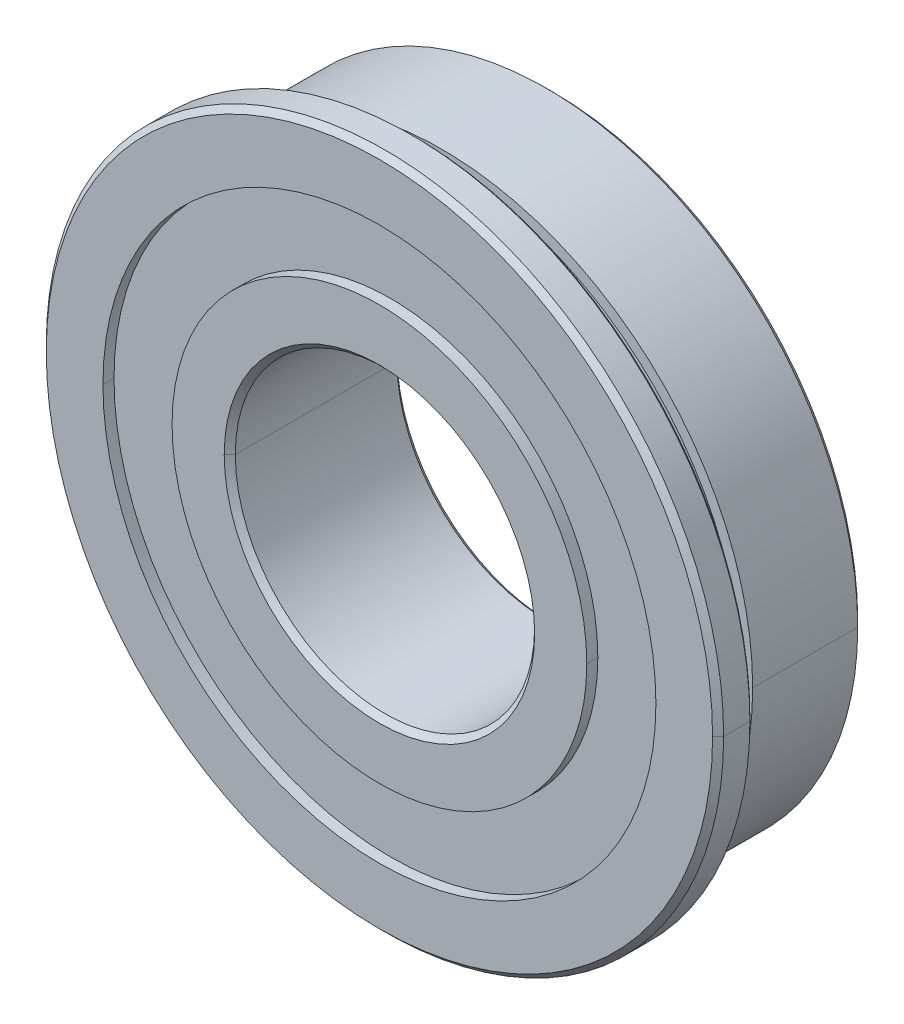
ISO-10303-21;
HEADER;
FILE_DESCRIPTION(('STEP AP214'),'2;1');
FILE_NAME('part.step','',(''),(''),'','','');
FILE_SCHEMA(('AUTOMOTIVE_DESIGN { 1 0 10303 214 1 1 1 1 }'));
ENDSEC;
DATA;
#1=APPLICATION_CONTEXT('core data for automotive mechanical design processes');
#2=APPLICATION_PROTOCOL_DEFINITION('international standard','automotive_design',2000,#1);
#3=PRODUCT_CONTEXT('',#1,'mechanical');
#4=PRODUCT('Part','Part','',(#3));
#5=PRODUCT_RELATED_PRODUCT_CATEGORY('part','',(#4));
#6=PRODUCT_DEFINITION_FORMATION('','',#4);
#7=PRODUCT_DEFINITION_CONTEXT('part definition',#1,'design');
#8=PRODUCT_DEFINITION('design','',#6,#7);
#9=PRODUCT_DEFINITION_SHAPE('','',#8);
#10=(LENGTH_UNIT() NAMED_UNIT(*) SI_UNIT(.MILLI.,.METRE.));
#11=(NAMED_UNIT(*) PLANE_ANGLE_UNIT() SI_UNIT($,.RADIAN.));
#12=(NAMED_UNIT(*) SI_UNIT($,.STERADIAN.) SOLID_ANGLE_UNIT());
#13=UNCERTAINTY_MEASURE_WITH_UNIT(LENGTH_MEASURE(1.E-05),#10,'distance_accuracy_value','');
#14=(GEOMETRIC_REPRESENTATION_CONTEXT(3) GLOBAL_UNCERTAINTY_ASSIGNED_CONTEXT((#13)) GLOBAL_UNIT_ASSIGNED_CONTEXT((#10,
#11,#12)) REPRESENTATION_CONTEXT('',''));
#15=CARTESIAN_POINT('',(0.,0.,0.));
#16=DIRECTION('',(0.,0.,1.));
#17=DIRECTION('',(1.,0.,0.));
#18=AXIS2_PLACEMENT_3D('',#15,#16,#17);
#19=CARTESIAN_POINT('',(0.,0.,2.50825));
#20=DIRECTION('',(0.,0.,1.));
#21=DIRECTION('',(1.,0.,0.));
#22=AXIS2_PLACEMENT_3D('',#19,#20,#21);
#23=CONICAL_SURFACE('',#22,15.5575,0.785398163397442);
#24=DIRECTION('',(-0.707106781186543,0.,0.707106781186552));
#25=VECTOR('',#24,1.);
#26=CARTESIAN_POINT('',(-15.5575,0.,2.50825));
#27=LINE('',#26,#25);
#28=CARTESIAN_POINT('',(-15.4305,0.,2.38125));
#29=VERTEX_POINT('',#28);
#30=CARTESIAN_POINT('',(-15.5575,0.,2.50825));
#31=VERTEX_POINT('',#30);
#32=EDGE_CURVE('E226',#29,#31,#27,.T.);
#33=ORIENTED_EDGE('',*,*,#32,.F.);
#34=CARTESIAN_POINT('',(0.,0.,2.38125));
#35=DIRECTION('',(0.,0.,-1.));
#36=DIRECTION('',(1.,0.,0.));
#37=AXIS2_PLACEMENT_3D('',#34,#35,#36);
#38=CIRCLE('',#37,15.4305);
#39=CARTESIAN_POINT('',(15.4305,0.,2.38125));
#40=VERTEX_POINT('',#39);
#41=EDGE_CURVE('E326',#40,#29,#38,.T.);
#42=ORIENTED_EDGE('',*,*,#41,.F.);
#43=DIRECTION('',(0.707106781186543,0.,0.707106781186552));
#44=VECTOR('',#43,1.);
#45=CARTESIAN_POINT('',(15.5575,0.,2.50825));
#46=LINE('',#45,#44);
#47=CARTESIAN_POINT('',(15.5575,0.,2.50825));
#48=VERTEX_POINT('',#47);
#49=EDGE_CURVE('E225',#40,#48,#46,.T.);
#50=ORIENTED_EDGE('',*,*,#49,.T.);
#51=CARTESIAN_POINT('',(0.,0.,2.50825));
#52=DIRECTION('',(0.,0.,1.));
#53=DIRECTION('',(1.,0.,0.));
#54=AXIS2_PLACEMENT_3D('',#51,#52,#53);
#55=CIRCLE('',#54,15.5575);
#56=EDGE_CURVE('E203',#31,#48,#55,.T.);
#57=ORIENTED_EDGE('',*,*,#56,.F.);
#58=EDGE_LOOP('',(#33,#42,#50,#57));
#59=FACE_BOUND('',#58,.T.);
#60=ADVANCED_FACE('F15',(#59),#23,.T.);
#61=CARTESIAN_POINT('',(0.,0.,3.71475));
#62=DIRECTION('',(0.,0.,1.));
#63=DIRECTION('',(1.,0.,0.));
#64=AXIS2_PLACEMENT_3D('',#61,#62,#63);
#65=CONICAL_SURFACE('',#64,6.875,0.785398163397442);
#66=DIRECTION('',(-0.707106781186543,0.,0.707106781186552));
#67=VECTOR('',#66,1.);
#68=CARTESIAN_POINT('',(-6.875,0.,3.71475));
#69=LINE('',#68,#67);
#70=CARTESIAN_POINT('',(-6.875,0.,3.71475));
#71=VERTEX_POINT('',#70);
#72=CARTESIAN_POINT('',(-7.129,0.,3.96875));
#73=VERTEX_POINT('',#72);
#74=EDGE_CURVE('E263',#71,#73,#69,.T.);
#75=ORIENTED_EDGE('',*,*,#74,.F.);
#76=CARTESIAN_POINT('',(0.,0.,3.71475));
#77=DIRECTION('',(0.,0.,1.));
#78=DIRECTION('',(-1.,0.,0.));
#79=AXIS2_PLACEMENT_3D('',#76,#77,#78);
#80=CIRCLE('',#79,6.875);
#81=CARTESIAN_POINT('',(6.875,0.,3.71475));
#82=VERTEX_POINT('',#81);
#83=EDGE_CURVE('E233',#82,#71,#80,.T.);
#84=ORIENTED_EDGE('',*,*,#83,.F.);
#85=DIRECTION('',(0.707106781186543,0.,0.707106781186552));
#86=VECTOR('',#85,1.);
#87=CARTESIAN_POINT('',(6.875,0.,3.71475));
#88=LINE('',#87,#86);
#89=CARTESIAN_POINT('',(7.129,0.,3.96875));
#90=VERTEX_POINT('',#89);
#91=EDGE_CURVE('E315',#82,#90,#88,.T.);
#92=ORIENTED_EDGE('',*,*,#91,.T.);
#93=CARTESIAN_POINT('',(0.,0.,3.96875));
#94=DIRECTION('',(0.,0.,-1.));
#95=DIRECTION('',(-1.,0.,0.));
#96=AXIS2_PLACEMENT_3D('',#93,#94,#95);
#97=CIRCLE('',#96,7.129);
#98=EDGE_CURVE('E304',#73,#90,#97,.T.);
#99=ORIENTED_EDGE('',*,*,#98,.F.);
#100=EDGE_LOOP('',(#75,#84,#92,#99));
#101=FACE_BOUND('',#100,.T.);
#102=ADVANCED_FACE('F521',(#101),#65,.F.);
#103=CARTESIAN_POINT('',(0.,0.,-3.96875));
#104=DIRECTION('',(0.,0.,-1.));
#105=DIRECTION('',(-1.,0.,0.));
#106=AXIS2_PLACEMENT_3D('',#103,#104,#105);
#107=CONICAL_SURFACE('',#106,7.129,0.785398163397446);
#108=DIRECTION('',(0.707106781186546,0.,-0.707106781186549));
#109=VECTOR('',#108,1.);
#110=CARTESIAN_POINT('',(7.129,0.,-3.96875));
#111=LINE('',#110,#109);
#112=CARTESIAN_POINT('',(6.875,0.,-3.71475));
#113=VERTEX_POINT('',#112);
#114=CARTESIAN_POINT('',(7.129,0.,-3.96875));
#115=VERTEX_POINT('',#114);
#116=EDGE_CURVE('E307',#113,#115,#111,.T.);
#117=ORIENTED_EDGE('',*,*,#116,.F.);
#118=CARTESIAN_POINT('',(0.,0.,-3.71475));
#119=DIRECTION('',(0.,0.,-1.));
#120=DIRECTION('',(1.,0.,0.));
#121=AXIS2_PLACEMENT_3D('',#118,#119,#120);
#122=CIRCLE('',#121,6.875);
#123=CARTESIAN_POINT('',(-6.875,0.,-3.71475));
#124=VERTEX_POINT('',#123);
#125=EDGE_CURVE('E208',#124,#113,#122,.T.);
#126=ORIENTED_EDGE('',*,*,#125,.F.);
#127=DIRECTION('',(-0.707106781186546,0.,-0.707106781186549));
#128=VECTOR('',#127,1.);
#129=CARTESIAN_POINT('',(-7.129,0.,-3.96875));
#130=LINE('',#129,#128);
#131=CARTESIAN_POINT('',(-7.129,0.,-3.96875));
#132=VERTEX_POINT('',#131);
#133=EDGE_CURVE('E244',#124,#132,#130,.T.);
#134=ORIENTED_EDGE('',*,*,#133,.T.);
#135=CARTESIAN_POINT('',(0.,0.,-3.96875));
#136=DIRECTION('',(0.,0.,1.));
#137=DIRECTION('',(1.,0.,0.));
#138=AXIS2_PLACEMENT_3D('',#135,#136,#137);
#139=CIRCLE('',#138,7.129);
#140=EDGE_CURVE('E200',#115,#132,#139,.T.);
#141=ORIENTED_EDGE('',*,*,#140,.F.);
#142=EDGE_LOOP('',(#117,#126,#134,#141));
#143=FACE_BOUND('',#142,.T.);
#144=ADVANCED_FACE('F526',(#143),#107,.F.);
#145=CARTESIAN_POINT('',(0.,0.,-3.71475));
#146=DIRECTION('',(0.,0.,1.));
#147=DIRECTION('',(1.,0.,0.));
#148=AXIS2_PLACEMENT_3D('',#145,#146,#147);
#149=CONICAL_SURFACE('',#148,14.2875,0.785398163397445);
#150=DIRECTION('',(-0.707106781186545,0.,0.70710678118655));
#151=VECTOR('',#150,1.);
#152=CARTESIAN_POINT('',(-14.2875,0.,-3.71475));
#153=LINE('',#152,#151);
#154=CARTESIAN_POINT('',(-14.0335,0.,-3.96875));
#155=VERTEX_POINT('',#154);
#156=CARTESIAN_POINT('',(-14.2875,0.,-3.71475));
#157=VERTEX_POINT('',#156);
#158=EDGE_CURVE('E193',#155,#157,#153,.T.);
#159=ORIENTED_EDGE('',*,*,#158,.F.);
#160=CARTESIAN_POINT('',(0.,0.,-3.96875));
#161=DIRECTION('',(0.,0.,-1.));
#162=DIRECTION('',(1.,0.,0.));
#163=AXIS2_PLACEMENT_3D('',#160,#161,#162);
#164=CIRCLE('',#163,14.0335);
#165=CARTESIAN_POINT('',(14.0335,0.,-3.96875));
#166=VERTEX_POINT('',#165);
#167=EDGE_CURVE('E237',#166,#155,#164,.T.);
#168=ORIENTED_EDGE('',*,*,#167,.F.);
#169=DIRECTION('',(0.707106781186545,0.,0.70710678118655));
#170=VECTOR('',#169,1.);
#171=CARTESIAN_POINT('',(14.2875,0.,-3.71475));
#172=LINE('',#171,#170);
#173=CARTESIAN_POINT('',(14.2875,0.,-3.71475));
#174=VERTEX_POINT('',#173);
#175=EDGE_CURVE('E195',#166,#174,#172,.T.);
#176=ORIENTED_EDGE('',*,*,#175,.T.);
#177=CARTESIAN_POINT('',(0.,0.,-3.71475));
#178=DIRECTION('',(0.,0.,1.));
#179=DIRECTION('',(1.,0.,0.));
#180=AXIS2_PLACEMENT_3D('',#177,#178,#179);
#181=CIRCLE('',#180,14.2875);
#182=EDGE_CURVE('E273',#157,#174,#181,.T.);
#183=ORIENTED_EDGE('',*,*,#182,.F.);
#184=EDGE_LOOP('',(#159,#168,#176,#183));
#185=FACE_BOUND('',#184,.T.);
#186=ADVANCED_FACE('F891',(#185),#149,.T.);
#187=CARTESIAN_POINT('',(0.,0.,3.96875));
#188=DIRECTION('',(0.,0.,-1.));
#189=DIRECTION('',(-1.,0.,0.));
#190=AXIS2_PLACEMENT_3D('',#187,#188,#189);
#191=CONICAL_SURFACE('',#190,15.3035,0.785398163397455);
#192=DIRECTION('',(0.707106781186552,0.,-0.707106781186543));
#193=VECTOR('',#192,1.);
#194=CARTESIAN_POINT('',(15.3035,0.,3.96875));
#195=LINE('',#194,#193);
#196=CARTESIAN_POINT('',(15.3035,0.,3.96875));
#197=VERTEX_POINT('',#196);
#198=CARTESIAN_POINT('',(15.5575,0.,3.71475));
#199=VERTEX_POINT('',#198);
#200=EDGE_CURVE('E232',#197,#199,#195,.T.);
#201=ORIENTED_EDGE('',*,*,#200,.F.);
#202=CARTESIAN_POINT('',(0.,0.,3.96875));
#203=DIRECTION('',(0.,0.,1.));
#204=DIRECTION('',(-1.,0.,0.));
#205=AXIS2_PLACEMENT_3D('',#202,#203,#204);
#206=CIRCLE('',#205,15.3035);
#207=CARTESIAN_POINT('',(-15.3035,0.,3.96875));
#208=VERTEX_POINT('',#207);
#209=EDGE_CURVE('E209',#208,#197,#206,.T.);
#210=ORIENTED_EDGE('',*,*,#209,.F.);
#211=DIRECTION('',(-0.707106781186552,0.,-0.707106781186543));
#212=VECTOR('',#211,1.);
#213=CARTESIAN_POINT('',(-15.3035,0.,3.96875));
#214=LINE('',#213,#212);
#215=CARTESIAN_POINT('',(-15.5575,0.,3.71475));
#216=VERTEX_POINT('',#215);
#217=EDGE_CURVE('E231',#208,#216,#214,.T.);
#218=ORIENTED_EDGE('',*,*,#217,.T.);
#219=CARTESIAN_POINT('',(0.,0.,3.71475));
#220=DIRECTION('',(0.,0.,-1.));
#221=DIRECTION('',(-1.,0.,0.));
#222=AXIS2_PLACEMENT_3D('',#219,#220,#221);
#223=CIRCLE('',#222,15.5575);
#224=EDGE_CURVE('E316',#199,#216,#223,.T.);
#225=ORIENTED_EDGE('',*,*,#224,.F.);
#226=EDGE_LOOP('',(#201,#210,#218,#225));
#227=FACE_BOUND('',#226,.T.);
#228=ADVANCED_FACE('F486',(#227),#191,.T.);
#229=CARTESIAN_POINT('',(0.,0.,3.46075));
#230=DIRECTION('',(0.,0.,1.));
#231=DIRECTION('',(1.,0.,0.));
#232=AXIS2_PLACEMENT_3D('',#229,#230,#231);
#233=CYLINDRICAL_SURFACE('',#232,9.525);
#234=DIRECTION('',(0.,0.,1.));
#235=VECTOR('',#234,1.);
#236=CARTESIAN_POINT('',(-9.525,0.,3.46075));
#237=LINE('',#236,#235);
#238=CARTESIAN_POINT('',(-9.525,0.,3.46075));
#239=VERTEX_POINT('',#238);
#240=CARTESIAN_POINT('',(-9.525,0.,3.96875));
#241=VERTEX_POINT('',#240);
#242=EDGE_CURVE('E278',#239,#241,#237,.T.);
#243=ORIENTED_EDGE('',*,*,#242,.F.);
#244=CARTESIAN_POINT('',(0.,0.,3.46075));
#245=DIRECTION('',(0.,0.,-1.));
#246=DIRECTION('',(-1.,0.,0.));
#247=AXIS2_PLACEMENT_3D('',#244,#245,#246);
#248=CIRCLE('',#247,9.525);
#249=CARTESIAN_POINT('',(9.525,0.,3.46075));
#250=VERTEX_POINT('',#249);
#251=EDGE_CURVE('E10',#250,#239,#248,.T.);
#252=ORIENTED_EDGE('',*,*,#251,.F.);
#253=DIRECTION('',(0.,0.,1.));
#254=VECTOR('',#253,1.);
#255=CARTESIAN_POINT('',(9.525,0.,3.46075));
#256=LINE('',#255,#254);
#257=CARTESIAN_POINT('',(9.525,0.,3.96875));
#258=VERTEX_POINT('',#257);
#259=EDGE_CURVE('E215',#250,#258,#256,.T.);
#260=ORIENTED_EDGE('',*,*,#259,.T.);
#261=CARTESIAN_POINT('',(0.,0.,3.96875));
#262=DIRECTION('',(0.,0.,-1.));
#263=DIRECTION('',(-1.,0.,0.));
#264=AXIS2_PLACEMENT_3D('',#261,#262,#263);
#265=CIRCLE('',#264,9.525);
#266=EDGE_CURVE('E19',#258,#241,#265,.T.);
#267=ORIENTED_EDGE('',*,*,#266,.T.);
#268=EDGE_LOOP('',(#243,#252,#260,#267));
#269=FACE_BOUND('',#268,.T.);
#270=ADVANCED_FACE('F421',(#269),#233,.T.);
#271=CARTESIAN_POINT('',(0.,0.,3.46075));
#272=DIRECTION('',(0.,0.,1.));
#273=DIRECTION('',(1.,0.,0.));
#274=AXIS2_PLACEMENT_3D('',#271,#272,#273);
#275=CYLINDRICAL_SURFACE('',#274,12.7);
#276=DIRECTION('',(0.,0.,1.));
#277=VECTOR('',#276,1.);
#278=CARTESIAN_POINT('',(-12.7,0.,3.46075));
#279=LINE('',#278,#277);
#280=CARTESIAN_POINT('',(-12.7,0.,3.46075));
#281=VERTEX_POINT('',#280);
#282=CARTESIAN_POINT('',(-12.7,0.,3.96875));
#283=VERTEX_POINT('',#282);
#284=EDGE_CURVE('E262',#281,#283,#279,.T.);
#285=ORIENTED_EDGE('',*,*,#284,.F.);
#286=CARTESIAN_POINT('',(0.,0.,3.46075));
#287=DIRECTION('',(0.,0.,-1.));
#288=DIRECTION('',(-1.,0.,0.));
#289=AXIS2_PLACEMENT_3D('',#286,#287,#288);
#290=CIRCLE('',#289,12.7);
#291=CARTESIAN_POINT('',(12.7,0.,3.46075));
#292=VERTEX_POINT('',#291);
#293=EDGE_CURVE('E26',#281,#292,#290,.T.);
#294=ORIENTED_EDGE('',*,*,#293,.T.);
#295=DIRECTION('',(0.,0.,1.));
#296=VECTOR('',#295,1.);
#297=CARTESIAN_POINT('',(12.7,0.,3.46075));
#298=LINE('',#297,#296);
#299=CARTESIAN_POINT('',(12.7,0.,3.96875));
#300=VERTEX_POINT('',#299);
#301=EDGE_CURVE('E179',#292,#300,#298,.T.);
#302=ORIENTED_EDGE('',*,*,#301,.T.);
#303=CARTESIAN_POINT('',(0.,0.,3.96875));
#304=DIRECTION('',(0.,0.,-1.));
#305=DIRECTION('',(-1.,0.,0.));
#306=AXIS2_PLACEMENT_3D('',#303,#304,#305);
#307=CIRCLE('',#306,12.7);
#308=EDGE_CURVE('E205',#283,#300,#307,.T.);
#309=ORIENTED_EDGE('',*,*,#308,.F.);
#310=EDGE_LOOP('',(#285,#294,#302,#309));
#311=FACE_BOUND('',#310,.T.);
#312=ADVANCED_FACE('F471',(#311),#275,.F.);
#313=CARTESIAN_POINT('',(0.,0.,3.46075));
#314=DIRECTION('',(0.,0.,1.));
#315=DIRECTION('',(1.,0.,0.));
#316=AXIS2_PLACEMENT_3D('',#313,#314,#315);
#317=PLANE('',#316);
#318=ORIENTED_EDGE('',*,*,#251,.T.);
#319=CARTESIAN_POINT('',(0.,0.,3.46075));
#320=DIRECTION('',(0.,0.,-1.));
#321=DIRECTION('',(-1.,0.,0.));
#322=AXIS2_PLACEMENT_3D('',#319,#320,#321);
#323=CIRCLE('',#322,9.525);
#324=EDGE_CURVE('E274',#239,#250,#323,.T.);
#325=ORIENTED_EDGE('',*,*,#324,.T.);
#326=EDGE_LOOP('',(#318,#325));
#327=FACE_BOUND('',#326,.T.);
#328=CARTESIAN_POINT('',(0.,0.,3.46075));
#329=DIRECTION('',(0.,0.,-1.));
#330=DIRECTION('',(-1.,0.,0.));
#331=AXIS2_PLACEMENT_3D('',#328,#329,#330);
#332=CIRCLE('',#331,12.7);
#333=EDGE_CURVE('E218',#292,#281,#332,.T.);
#334=ORIENTED_EDGE('',*,*,#333,.F.);
#335=ORIENTED_EDGE('',*,*,#293,.F.);
#336=EDGE_LOOP('',(#334,#335));
#337=FACE_BOUND('',#336,.T.);
#338=ADVANCED_FACE('F423',(#327,#337),#317,.T.);
#339=CARTESIAN_POINT('',(0.,0.,-3.46075));
#340=DIRECTION('',(0.,0.,-1.));
#341=DIRECTION('',(-1.,0.,0.));
#342=AXIS2_PLACEMENT_3D('',#339,#340,#341);
#343=CYLINDRICAL_SURFACE('',#342,9.525);
#344=DIRECTION('',(0.,0.,-1.));
#345=VECTOR('',#344,1.);
#346=CARTESIAN_POINT('',(9.525,0.,-3.46075));
#347=LINE('',#346,#345);
#348=CARTESIAN_POINT('',(9.525,0.,-3.46075));
#349=VERTEX_POINT('',#348);
#350=CARTESIAN_POINT('',(9.525,0.,-3.96875));
#351=VERTEX_POINT('',#350);
#352=EDGE_CURVE('E163',#349,#351,#347,.T.);
#353=ORIENTED_EDGE('',*,*,#352,.F.);
#354=CARTESIAN_POINT('',(0.,0.,-3.46075));
#355=DIRECTION('',(0.,0.,-1.));
#356=DIRECTION('',(-1.,0.,0.));
#357=AXIS2_PLACEMENT_3D('',#354,#355,#356);
#358=CIRCLE('',#357,9.525);
#359=CARTESIAN_POINT('',(-9.525,0.,-3.46075));
#360=VERTEX_POINT('',#359);
#361=EDGE_CURVE('E151',#349,#360,#358,.T.);
#362=ORIENTED_EDGE('',*,*,#361,.T.);
#363=DIRECTION('',(0.,0.,-1.));
#364=VECTOR('',#363,1.);
#365=CARTESIAN_POINT('',(-9.525,0.,-3.46075));
#366=LINE('',#365,#364);
#367=CARTESIAN_POINT('',(-9.525,0.,-3.96875));
#368=VERTEX_POINT('',#367);
#369=EDGE_CURVE('E160',#360,#368,#366,.T.);
#370=ORIENTED_EDGE('',*,*,#369,.T.);
#371=CARTESIAN_POINT('',(0.,0.,-3.96875));
#372=DIRECTION('',(0.,0.,-1.));
#373=DIRECTION('',(-1.,0.,0.));
#374=AXIS2_PLACEMENT_3D('',#371,#372,#373);
#375=CIRCLE('',#374,9.525);
#376=EDGE_CURVE('E204',#351,#368,#375,.T.);
#377=ORIENTED_EDGE('',*,*,#376,.F.);
#378=EDGE_LOOP('',(#353,#362,#370,#377));
#379=FACE_BOUND('',#378,.T.);
#380=ADVANCED_FACE('F159',(#379),#343,.T.);
#381=CARTESIAN_POINT('',(0.,0.,-3.46075));
#382=DIRECTION('',(0.,0.,-1.));
#383=DIRECTION('',(0.,-1.,0.));
#384=AXIS2_PLACEMENT_3D('',#381,#382,#383);
#385=PLANE('',#384);
#386=CARTESIAN_POINT('',(0.,0.,-3.46075));
#387=DIRECTION('',(0.,0.,-1.));
#388=DIRECTION('',(-1.,0.,0.));
#389=AXIS2_PLACEMENT_3D('',#386,#387,#388);
#390=CIRCLE('',#389,9.525);
#391=EDGE_CURVE('E170',#360,#349,#390,.T.);
#392=ORIENTED_EDGE('',*,*,#391,.F.);
#393=ORIENTED_EDGE('',*,*,#361,.F.);
#394=EDGE_LOOP('',(#392,#393));
#395=FACE_BOUND('',#394,.T.);
#396=CARTESIAN_POINT('',(0.,0.,-3.46075));
#397=DIRECTION('',(0.,0.,-1.));
#398=DIRECTION('',(-1.,0.,0.));
#399=AXIS2_PLACEMENT_3D('',#396,#397,#398);
#400=CIRCLE('',#399,12.7);
#401=CARTESIAN_POINT('',(-12.7,0.,-3.46075));
#402=VERTEX_POINT('',#401);
#403=CARTESIAN_POINT('',(12.7,0.,-3.46075));
#404=VERTEX_POINT('',#403);
#405=EDGE_CURVE('E166',#402,#404,#400,.T.);
#406=ORIENTED_EDGE('',*,*,#405,.T.);
#407=CARTESIAN_POINT('',(0.,0.,-3.46075));
#408=DIRECTION('',(0.,0.,-1.));
#409=DIRECTION('',(-1.,0.,0.));
#410=AXIS2_PLACEMENT_3D('',#407,#408,#409);
#411=CIRCLE('',#410,12.7);
#412=EDGE_CURVE('E174',#404,#402,#411,.T.);
#413=ORIENTED_EDGE('',*,*,#412,.T.);
#414=EDGE_LOOP('',(#406,#413));
#415=FACE_BOUND('',#414,.T.);
#416=ADVANCED_FACE('F176',(#395,#415),#385,.T.);
#417=CARTESIAN_POINT('',(0.,0.,-3.46075));
#418=DIRECTION('',(0.,0.,-1.));
#419=DIRECTION('',(-1.,0.,0.));
#420=AXIS2_PLACEMENT_3D('',#417,#418,#419);
#421=CYLINDRICAL_SURFACE('',#420,12.7);
#422=DIRECTION('',(0.,0.,-1.));
#423=VECTOR('',#422,1.);
#424=CARTESIAN_POINT('',(12.7,0.,-3.46075));
#425=LINE('',#424,#423);
#426=CARTESIAN_POINT('',(12.7,0.,-3.96875));
#427=VERTEX_POINT('',#426);
#428=EDGE_CURVE('E292',#404,#427,#425,.T.);
#429=ORIENTED_EDGE('',*,*,#428,.F.);
#430=ORIENTED_EDGE('',*,*,#405,.F.);
#431=DIRECTION('',(0.,0.,-1.));
#432=VECTOR('',#431,1.);
#433=CARTESIAN_POINT('',(-12.7,0.,-3.46075));
#434=LINE('',#433,#432);
#435=CARTESIAN_POINT('',(-12.7,0.,-3.96875));
#436=VERTEX_POINT('',#435);
#437=EDGE_CURVE('E366',#402,#436,#434,.T.);
#438=ORIENTED_EDGE('',*,*,#437,.T.);
#439=CARTESIAN_POINT('',(0.,0.,-3.96875));
#440=DIRECTION('',(0.,0.,-1.));
#441=DIRECTION('',(-1.,0.,0.));
#442=AXIS2_PLACEMENT_3D('',#439,#440,#441);
#443=CIRCLE('',#442,12.7);
#444=EDGE_CURVE('E269',#436,#427,#443,.T.);
#445=ORIENTED_EDGE('',*,*,#444,.T.);
#446=EDGE_LOOP('',(#429,#430,#438,#445));
#447=FACE_BOUND('',#446,.T.);
#448=ADVANCED_FACE('F505',(#447),#421,.F.);
#449=CARTESIAN_POINT('',(0.,14.2875,2.38125));
#450=DIRECTION('',(0.,0.,1.));
#451=DIRECTION('',(1.,0.,0.));
#452=AXIS2_PLACEMENT_3D('',#449,#450,#451);
#453=PLANE('',#452);
#454=CARTESIAN_POINT('',(0.,0.,2.38125));
#455=DIRECTION('',(0.,0.,1.));
#456=DIRECTION('',(1.,0.,0.));
#457=AXIS2_PLACEMENT_3D('',#454,#455,#456);
#458=CIRCLE('',#457,13.7795);
#459=CARTESIAN_POINT('',(13.7795,0.,2.38125));
#460=VERTEX_POINT('',#459);
#461=CARTESIAN_POINT('',(-13.7795,0.,2.38125));
#462=VERTEX_POINT('',#461);
#463=EDGE_CURVE('E299',#460,#462,#458,.T.);
#464=ORIENTED_EDGE('',*,*,#463,.T.);
#465=CARTESIAN_POINT('',(0.,0.,2.38125));
#466=DIRECTION('',(0.,0.,1.));
#467=DIRECTION('',(1.,0.,0.));
#468=AXIS2_PLACEMENT_3D('',#465,#466,#467);
#469=CIRCLE('',#468,13.7795);
#470=EDGE_CURVE('E258',#462,#460,#469,.T.);
#471=ORIENTED_EDGE('',*,*,#470,.T.);
#472=EDGE_LOOP('',(#464,#471));
#473=FACE_BOUND('',#472,.T.);
#474=ORIENTED_EDGE('',*,*,#41,.T.);
#475=CARTESIAN_POINT('',(0.,0.,2.38125));
#476=DIRECTION('',(0.,0.,-1.));
#477=DIRECTION('',(1.,0.,0.));
#478=AXIS2_PLACEMENT_3D('',#475,#476,#477);
#479=CIRCLE('',#478,15.4305);
#480=EDGE_CURVE('E341',#29,#40,#479,.T.);
#481=ORIENTED_EDGE('',*,*,#480,.T.);
#482=EDGE_LOOP('',(#474,#481));
#483=FACE_BOUND('',#482,.T.);
#484=ADVANCED_FACE('F502',(#473,#483),#453,.F.);
#485=CARTESIAN_POINT('',(0.,0.,6.18055555555556));
#486=DIRECTION('',(0.,0.,1.));
#487=DIRECTION('',(1.,0.,0.));
#488=AXIS2_PLACEMENT_3D('',#485,#486,#487);
#489=CYLINDRICAL_SURFACE('',#488,13.7795);
#490=DIRECTION('',(0.,0.,1.));
#491=VECTOR('',#490,1.);
#492=CARTESIAN_POINT('',(-13.7795,0.,6.18055555555556));
#493=LINE('',#492,#491);
#494=CARTESIAN_POINT('',(-13.7795,0.,1.11125));
#495=VERTEX_POINT('',#494);
#496=EDGE_CURVE('E296',#495,#462,#493,.T.);
#497=ORIENTED_EDGE('',*,*,#496,.F.);
#498=CARTESIAN_POINT('',(0.,0.,1.11125));
#499=DIRECTION('',(0.,0.,1.));
#500=DIRECTION('',(1.,0.,0.));
#501=AXIS2_PLACEMENT_3D('',#498,#499,#500);
#502=CIRCLE('',#501,13.7795);
#503=CARTESIAN_POINT('',(13.7795,0.,1.11125));
#504=VERTEX_POINT('',#503);
#505=EDGE_CURVE('E255',#495,#504,#502,.T.);
#506=ORIENTED_EDGE('',*,*,#505,.T.);
#507=DIRECTION('',(0.,0.,1.));
#508=VECTOR('',#507,1.);
#509=CARTESIAN_POINT('',(13.7795,0.,6.18055555555556));
#510=LINE('',#509,#508);
#511=EDGE_CURVE('E348',#504,#460,#510,.T.);
#512=ORIENTED_EDGE('',*,*,#511,.T.);
#513=ORIENTED_EDGE('',*,*,#470,.F.);
#514=EDGE_LOOP('',(#497,#506,#512,#513));
#515=FACE_BOUND('',#514,.T.);
#516=ADVANCED_FACE('F504',(#515),#489,.T.);
#517=CARTESIAN_POINT('',(0.,13.7795,1.11125));
#518=DIRECTION('',(0.,0.,-1.));
#519=DIRECTION('',(0.,-1.,0.));
#520=AXIS2_PLACEMENT_3D('',#517,#518,#519);
#521=PLANE('',#520);
#522=CARTESIAN_POINT('',(0.,0.,1.11125));
#523=DIRECTION('',(0.,0.,1.));
#524=DIRECTION('',(1.,0.,0.));
#525=AXIS2_PLACEMENT_3D('',#522,#523,#524);
#526=CIRCLE('',#525,13.7795);
#527=EDGE_CURVE('E300',#504,#495,#526,.T.);
#528=ORIENTED_EDGE('',*,*,#527,.F.);
#529=ORIENTED_EDGE('',*,*,#505,.F.);
#530=EDGE_LOOP('',(#528,#529));
#531=FACE_BOUND('',#530,.T.);
#532=CARTESIAN_POINT('',(0.,0.,1.11125));
#533=DIRECTION('',(0.,0.,1.));
#534=DIRECTION('',(1.,0.,0.));
#535=AXIS2_PLACEMENT_3D('',#532,#533,#534);
#536=CIRCLE('',#535,14.2875);
#537=CARTESIAN_POINT('',(14.2875,0.,1.11125));
#538=VERTEX_POINT('',#537);
#539=CARTESIAN_POINT('',(-14.2875,0.,1.11125));
#540=VERTEX_POINT('',#539);
#541=EDGE_CURVE('E214',#538,#540,#536,.T.);
#542=ORIENTED_EDGE('',*,*,#541,.T.);
#543=CARTESIAN_POINT('',(0.,0.,1.11125));
#544=DIRECTION('',(0.,0.,1.));
#545=DIRECTION('',(1.,0.,0.));
#546=AXIS2_PLACEMENT_3D('',#543,#544,#545);
#547=CIRCLE('',#546,14.2875);
#548=EDGE_CURVE('E40',#540,#538,#547,.T.);
#549=ORIENTED_EDGE('',*,*,#548,.T.);
#550=EDGE_LOOP('',(#542,#549));
#551=FACE_BOUND('',#550,.T.);
#552=ADVANCED_FACE('F513',(#531,#551),#521,.F.);
#553=CARTESIAN_POINT('',(0.,0.,6.18055555555556));
#554=DIRECTION('',(0.,0.,1.));
#555=DIRECTION('',(1.,0.,0.));
#556=AXIS2_PLACEMENT_3D('',#553,#554,#555);
#557=CYLINDRICAL_SURFACE('',#556,14.2875);
#558=DIRECTION('',(0.,0.,1.));
#559=VECTOR('',#558,1.);
#560=CARTESIAN_POINT('',(-14.2875,0.,6.18055555555556));
#561=LINE('',#560,#559);
#562=EDGE_CURVE('E352',#157,#540,#561,.T.);
#563=ORIENTED_EDGE('',*,*,#562,.F.);
#564=ORIENTED_EDGE('',*,*,#182,.T.);
#565=DIRECTION('',(0.,0.,1.));
#566=VECTOR('',#565,1.);
#567=CARTESIAN_POINT('',(14.2875,0.,6.18055555555556));
#568=LINE('',#567,#566);
#569=EDGE_CURVE('E210',#174,#538,#568,.T.);
#570=ORIENTED_EDGE('',*,*,#569,.T.);
#571=ORIENTED_EDGE('',*,*,#548,.F.);
#572=EDGE_LOOP('',(#563,#564,#570,#571));
#573=FACE_BOUND('',#572,.T.);
#574=ADVANCED_FACE('F824',(#573),#557,.T.);
#575=CARTESIAN_POINT('',(0.,6.875,-3.96875));
#576=DIRECTION('',(0.,0.,1.));
#577=DIRECTION('',(1.,0.,0.));
#578=AXIS2_PLACEMENT_3D('',#575,#576,#577);
#579=PLANE('',#578);
#580=ORIENTED_EDGE('',*,*,#444,.F.);
#581=CARTESIAN_POINT('',(0.,0.,-3.96875));
#582=DIRECTION('',(0.,0.,-1.));
#583=DIRECTION('',(-1.,0.,0.));
#584=AXIS2_PLACEMENT_3D('',#581,#582,#583);
#585=CIRCLE('',#584,12.7);
#586=EDGE_CURVE('E359',#427,#436,#585,.T.);
#587=ORIENTED_EDGE('',*,*,#586,.F.);
#588=EDGE_LOOP('',(#580,#587));
#589=FACE_BOUND('',#588,.T.);
#590=ORIENTED_EDGE('',*,*,#167,.T.);
#591=CARTESIAN_POINT('',(0.,0.,-3.96875));
#592=DIRECTION('',(0.,0.,-1.));
#593=DIRECTION('',(1.,0.,0.));
#594=AXIS2_PLACEMENT_3D('',#591,#592,#593);
#595=CIRCLE('',#594,14.0335);
#596=EDGE_CURVE('E248',#155,#166,#595,.T.);
#597=ORIENTED_EDGE('',*,*,#596,.T.);
#598=EDGE_LOOP('',(#590,#597));
#599=FACE_BOUND('',#598,.T.);
#600=ADVANCED_FACE('F828',(#589,#599),#579,.F.);
#601=CARTESIAN_POINT('',(0.,0.,6.18055555555556));
#602=DIRECTION('',(0.,0.,1.));
#603=DIRECTION('',(1.,0.,0.));
#604=AXIS2_PLACEMENT_3D('',#601,#602,#603);
#605=CYLINDRICAL_SURFACE('',#604,6.875);
#606=DIRECTION('',(0.,0.,1.));
#607=VECTOR('',#606,1.);
#608=CARTESIAN_POINT('',(-6.875,0.,6.18055555555556));
#609=LINE('',#608,#607);
#610=EDGE_CURVE('E213',#124,#71,#609,.T.);
#611=ORIENTED_EDGE('',*,*,#610,.F.);
#612=ORIENTED_EDGE('',*,*,#125,.T.);
#613=DIRECTION('',(0.,0.,1.));
#614=VECTOR('',#613,1.);
#615=CARTESIAN_POINT('',(6.875,0.,6.18055555555556));
#616=LINE('',#615,#614);
#617=EDGE_CURVE('E250',#113,#82,#616,.T.);
#618=ORIENTED_EDGE('',*,*,#617,.T.);
#619=ORIENTED_EDGE('',*,*,#83,.T.);
#620=EDGE_LOOP('',(#611,#612,#618,#619));
#621=FACE_BOUND('',#620,.T.);
#622=ADVANCED_FACE('F480',(#621),#605,.F.);
#623=CARTESIAN_POINT('',(0.,15.5575,3.96875));
#624=DIRECTION('',(0.,0.,-1.));
#625=DIRECTION('',(0.,-1.,0.));
#626=AXIS2_PLACEMENT_3D('',#623,#624,#625);
#627=PLANE('',#626);
#628=CARTESIAN_POINT('',(0.,0.,3.96875));
#629=DIRECTION('',(0.,0.,-1.));
#630=DIRECTION('',(-1.,0.,0.));
#631=AXIS2_PLACEMENT_3D('',#628,#629,#630);
#632=CIRCLE('',#631,12.7);
#633=EDGE_CURVE('E189',#300,#283,#632,.T.);
#634=ORIENTED_EDGE('',*,*,#633,.T.);
#635=ORIENTED_EDGE('',*,*,#308,.T.);
#636=EDGE_LOOP('',(#634,#635));
#637=FACE_BOUND('',#636,.T.);
#638=ORIENTED_EDGE('',*,*,#209,.T.);
#639=CARTESIAN_POINT('',(0.,0.,3.96875));
#640=DIRECTION('',(0.,0.,1.));
#641=DIRECTION('',(-1.,0.,0.));
#642=AXIS2_PLACEMENT_3D('',#639,#640,#641);
#643=CIRCLE('',#642,15.3035);
#644=EDGE_CURVE('E198',#197,#208,#643,.T.);
#645=ORIENTED_EDGE('',*,*,#644,.T.);
#646=EDGE_LOOP('',(#638,#645));
#647=FACE_BOUND('',#646,.T.);
#648=ADVANCED_FACE('F476',(#637,#647),#627,.F.);
#649=CARTESIAN_POINT('',(0.,0.,6.18055555555556));
#650=DIRECTION('',(0.,0.,1.));
#651=DIRECTION('',(1.,0.,0.));
#652=AXIS2_PLACEMENT_3D('',#649,#650,#651);
#653=CYLINDRICAL_SURFACE('',#652,15.5575);
#654=DIRECTION('',(0.,0.,1.));
#655=VECTOR('',#654,1.);
#656=CARTESIAN_POINT('',(-15.5575,0.,6.18055555555556));
#657=LINE('',#656,#655);
#658=EDGE_CURVE('E254',#31,#216,#657,.T.);
#659=ORIENTED_EDGE('',*,*,#658,.F.);
#660=ORIENTED_EDGE('',*,*,#56,.T.);
#661=DIRECTION('',(0.,0.,1.));
#662=VECTOR('',#661,1.);
#663=CARTESIAN_POINT('',(15.5575,0.,6.18055555555556));
#664=LINE('',#663,#662);
#665=EDGE_CURVE('E335',#48,#199,#664,.T.);
#666=ORIENTED_EDGE('',*,*,#665,.T.);
#667=ORIENTED_EDGE('',*,*,#224,.T.);
#668=EDGE_LOOP('',(#659,#660,#666,#667));
#669=FACE_BOUND('',#668,.T.);
#670=ADVANCED_FACE('F479',(#669),#653,.T.);
#671=CARTESIAN_POINT('',(0.,6.875,-3.96875));
#672=DIRECTION('',(0.,0.,1.));
#673=DIRECTION('',(1.,0.,0.));
#674=AXIS2_PLACEMENT_3D('',#671,#672,#673);
#675=PLANE('',#674);
#676=CARTESIAN_POINT('',(0.,0.,-3.96875));
#677=DIRECTION('',(0.,0.,1.));
#678=DIRECTION('',(1.,0.,0.));
#679=AXIS2_PLACEMENT_3D('',#676,#677,#678);
#680=CIRCLE('',#679,7.129);
#681=EDGE_CURVE('E249',#132,#115,#680,.T.);
#682=ORIENTED_EDGE('',*,*,#681,.T.);
#683=ORIENTED_EDGE('',*,*,#140,.T.);
#684=EDGE_LOOP('',(#682,#683));
#685=FACE_BOUND('',#684,.T.);
#686=CARTESIAN_POINT('',(0.,0.,-3.96875));
#687=DIRECTION('',(0.,0.,-1.));
#688=DIRECTION('',(-1.,0.,0.));
#689=AXIS2_PLACEMENT_3D('',#686,#687,#688);
#690=CIRCLE('',#689,9.525);
#691=EDGE_CURVE('E172',#368,#351,#690,.T.);
#692=ORIENTED_EDGE('',*,*,#691,.T.);
#693=ORIENTED_EDGE('',*,*,#376,.T.);
#694=EDGE_LOOP('',(#692,#693));
#695=FACE_BOUND('',#694,.T.);
#696=ADVANCED_FACE('F532',(#685,#695),#675,.F.);
#697=CARTESIAN_POINT('',(0.,15.5575,3.96875));
#698=DIRECTION('',(0.,0.,-1.));
#699=DIRECTION('',(0.,-1.,0.));
#700=AXIS2_PLACEMENT_3D('',#697,#698,#699);
#701=PLANE('',#700);
#702=CARTESIAN_POINT('',(0.,0.,3.96875));
#703=DIRECTION('',(0.,0.,-1.));
#704=DIRECTION('',(-1.,0.,0.));
#705=AXIS2_PLACEMENT_3D('',#702,#703,#704);
#706=CIRCLE('',#705,7.129);
#707=EDGE_CURVE('E267',#90,#73,#706,.T.);
#708=ORIENTED_EDGE('',*,*,#707,.T.);
#709=ORIENTED_EDGE('',*,*,#98,.T.);
#710=EDGE_LOOP('',(#708,#709));
#711=FACE_BOUND('',#710,.T.);
#712=ORIENTED_EDGE('',*,*,#266,.F.);
#713=CARTESIAN_POINT('',(0.,0.,3.96875));
#714=DIRECTION('',(0.,0.,-1.));
#715=DIRECTION('',(-1.,0.,0.));
#716=AXIS2_PLACEMENT_3D('',#713,#714,#715);
#717=CIRCLE('',#716,9.525);
#718=EDGE_CURVE('E219',#241,#258,#717,.T.);
#719=ORIENTED_EDGE('',*,*,#718,.F.);
#720=EDGE_LOOP('',(#712,#719));
#721=FACE_BOUND('',#720,.T.);
#722=ADVANCED_FACE('F419',(#711,#721),#701,.F.);
#723=CARTESIAN_POINT('',(0.,0.,6.18055555555556));
#724=DIRECTION('',(0.,0.,1.));
#725=DIRECTION('',(1.,0.,0.));
#726=AXIS2_PLACEMENT_3D('',#723,#724,#725);
#727=CYLINDRICAL_SURFACE('',#726,15.5575);
#728=CARTESIAN_POINT('',(0.,0.,2.50825));
#729=DIRECTION('',(0.,0.,1.));
#730=DIRECTION('',(1.,0.,0.));
#731=AXIS2_PLACEMENT_3D('',#728,#729,#730);
#732=CIRCLE('',#731,15.5575);
#733=EDGE_CURVE('E221',#48,#31,#732,.T.);
#734=ORIENTED_EDGE('',*,*,#733,.T.);
#735=ORIENTED_EDGE('',*,*,#658,.T.);
#736=CARTESIAN_POINT('',(0.,0.,3.71475));
#737=DIRECTION('',(0.,0.,-1.));
#738=DIRECTION('',(-1.,0.,0.));
#739=AXIS2_PLACEMENT_3D('',#736,#737,#738);
#740=CIRCLE('',#739,15.5575);
#741=EDGE_CURVE('E227',#216,#199,#740,.T.);
#742=ORIENTED_EDGE('',*,*,#741,.T.);
#743=ORIENTED_EDGE('',*,*,#665,.F.);
#744=EDGE_LOOP('',(#734,#735,#742,#743));
#745=FACE_BOUND('',#744,.T.);
#746=ADVANCED_FACE('F492',(#745),#727,.T.);
#747=CARTESIAN_POINT('',(0.,0.,6.18055555555556));
#748=DIRECTION('',(0.,0.,1.));
#749=DIRECTION('',(1.,0.,0.));
#750=AXIS2_PLACEMENT_3D('',#747,#748,#749);
#751=CYLINDRICAL_SURFACE('',#750,6.875);
#752=CARTESIAN_POINT('',(0.,0.,-3.71475));
#753=DIRECTION('',(0.,0.,-1.));
#754=DIRECTION('',(1.,0.,0.));
#755=AXIS2_PLACEMENT_3D('',#752,#753,#754);
#756=CIRCLE('',#755,6.875);
#757=EDGE_CURVE('E311',#113,#124,#756,.T.);
#758=ORIENTED_EDGE('',*,*,#757,.T.);
#759=ORIENTED_EDGE('',*,*,#610,.T.);
#760=CARTESIAN_POINT('',(0.,0.,3.71475));
#761=DIRECTION('',(0.,0.,1.));
#762=DIRECTION('',(-1.,0.,0.));
#763=AXIS2_PLACEMENT_3D('',#760,#761,#762);
#764=CIRCLE('',#763,6.875);
#765=EDGE_CURVE('E268',#71,#82,#764,.T.);
#766=ORIENTED_EDGE('',*,*,#765,.T.);
#767=ORIENTED_EDGE('',*,*,#617,.F.);
#768=EDGE_LOOP('',(#758,#759,#766,#767));
#769=FACE_BOUND('',#768,.T.);
#770=ADVANCED_FACE('F543',(#769),#751,.F.);
#771=CARTESIAN_POINT('',(0.,0.,6.18055555555556));
#772=DIRECTION('',(0.,0.,1.));
#773=DIRECTION('',(1.,0.,0.));
#774=AXIS2_PLACEMENT_3D('',#771,#772,#773);
#775=CYLINDRICAL_SURFACE('',#774,14.2875);
#776=CARTESIAN_POINT('',(0.,0.,-3.71475));
#777=DIRECTION('',(0.,0.,1.));
#778=DIRECTION('',(1.,0.,0.));
#779=AXIS2_PLACEMENT_3D('',#776,#777,#778);
#780=CIRCLE('',#779,14.2875);
#781=EDGE_CURVE('E199',#174,#157,#780,.T.);
#782=ORIENTED_EDGE('',*,*,#781,.T.);
#783=ORIENTED_EDGE('',*,*,#562,.T.);
#784=ORIENTED_EDGE('',*,*,#541,.F.);
#785=ORIENTED_EDGE('',*,*,#569,.F.);
#786=EDGE_LOOP('',(#782,#783,#784,#785));
#787=FACE_BOUND('',#786,.T.);
#788=ADVANCED_FACE('F545',(#787),#775,.T.);
#789=CARTESIAN_POINT('',(0.,0.,6.18055555555556));
#790=DIRECTION('',(0.,0.,1.));
#791=DIRECTION('',(1.,0.,0.));
#792=AXIS2_PLACEMENT_3D('',#789,#790,#791);
#793=CYLINDRICAL_SURFACE('',#792,13.7795);
#794=ORIENTED_EDGE('',*,*,#527,.T.);
#795=ORIENTED_EDGE('',*,*,#496,.T.);
#796=ORIENTED_EDGE('',*,*,#463,.F.);
#797=ORIENTED_EDGE('',*,*,#511,.F.);
#798=EDGE_LOOP('',(#794,#795,#796,#797));
#799=FACE_BOUND('',#798,.T.);
#800=ADVANCED_FACE('F547',(#799),#793,.T.);
#801=CARTESIAN_POINT('',(0.,0.,-3.46075));
#802=DIRECTION('',(0.,0.,-1.));
#803=DIRECTION('',(-1.,0.,0.));
#804=AXIS2_PLACEMENT_3D('',#801,#802,#803);
#805=CYLINDRICAL_SURFACE('',#804,12.7);
#806=ORIENTED_EDGE('',*,*,#412,.F.);
#807=ORIENTED_EDGE('',*,*,#428,.T.);
#808=ORIENTED_EDGE('',*,*,#586,.T.);
#809=ORIENTED_EDGE('',*,*,#437,.F.);
#810=EDGE_LOOP('',(#806,#807,#808,#809));
#811=FACE_BOUND('',#810,.T.);
#812=ADVANCED_FACE('F553',(#811),#805,.F.);
#813=CARTESIAN_POINT('',(0.,0.,-3.46075));
#814=DIRECTION('',(0.,0.,-1.));
#815=DIRECTION('',(-1.,0.,0.));
#816=AXIS2_PLACEMENT_3D('',#813,#814,#815);
#817=CYLINDRICAL_SURFACE('',#816,9.525);
#818=ORIENTED_EDGE('',*,*,#391,.T.);
#819=ORIENTED_EDGE('',*,*,#352,.T.);
#820=ORIENTED_EDGE('',*,*,#691,.F.);
#821=ORIENTED_EDGE('',*,*,#369,.F.);
#822=EDGE_LOOP('',(#818,#819,#820,#821));
#823=FACE_BOUND('',#822,.T.);
#824=ADVANCED_FACE('F169',(#823),#817,.T.);
#825=CARTESIAN_POINT('',(0.,0.,3.46075));
#826=DIRECTION('',(0.,0.,1.));
#827=DIRECTION('',(1.,0.,0.));
#828=AXIS2_PLACEMENT_3D('',#825,#826,#827);
#829=CYLINDRICAL_SURFACE('',#828,12.7);
#830=ORIENTED_EDGE('',*,*,#333,.T.);
#831=ORIENTED_EDGE('',*,*,#284,.T.);
#832=ORIENTED_EDGE('',*,*,#633,.F.);
#833=ORIENTED_EDGE('',*,*,#301,.F.);
#834=EDGE_LOOP('',(#830,#831,#832,#833));
#835=FACE_BOUND('',#834,.T.);
#836=ADVANCED_FACE('F474',(#835),#829,.F.);
#837=CARTESIAN_POINT('',(0.,0.,3.46075));
#838=DIRECTION('',(0.,0.,1.));
#839=DIRECTION('',(1.,0.,0.));
#840=AXIS2_PLACEMENT_3D('',#837,#838,#839);
#841=CYLINDRICAL_SURFACE('',#840,9.525);
#842=ORIENTED_EDGE('',*,*,#324,.F.);
#843=ORIENTED_EDGE('',*,*,#242,.T.);
#844=ORIENTED_EDGE('',*,*,#718,.T.);
#845=ORIENTED_EDGE('',*,*,#259,.F.);
#846=EDGE_LOOP('',(#842,#843,#844,#845));
#847=FACE_BOUND('',#846,.T.);
#848=ADVANCED_FACE('F416',(#847),#841,.T.);
#849=CARTESIAN_POINT('',(0.,0.,3.96875));
#850=DIRECTION('',(0.,0.,-1.));
#851=DIRECTION('',(-1.,0.,0.));
#852=AXIS2_PLACEMENT_3D('',#849,#850,#851);
#853=CONICAL_SURFACE('',#852,15.3035,0.785398163397455);
#854=ORIENTED_EDGE('',*,*,#644,.F.);
#855=ORIENTED_EDGE('',*,*,#200,.T.);
#856=ORIENTED_EDGE('',*,*,#741,.F.);
#857=ORIENTED_EDGE('',*,*,#217,.F.);
#858=EDGE_LOOP('',(#854,#855,#856,#857));
#859=FACE_BOUND('',#858,.T.);
#860=ADVANCED_FACE('F489',(#859),#853,.T.);
#861=CARTESIAN_POINT('',(0.,0.,-3.71475));
#862=DIRECTION('',(0.,0.,1.));
#863=DIRECTION('',(1.,0.,0.));
#864=AXIS2_PLACEMENT_3D('',#861,#862,#863);
#865=CONICAL_SURFACE('',#864,14.2875,0.785398163397445);
#866=ORIENTED_EDGE('',*,*,#596,.F.);
#867=ORIENTED_EDGE('',*,*,#158,.T.);
#868=ORIENTED_EDGE('',*,*,#781,.F.);
#869=ORIENTED_EDGE('',*,*,#175,.F.);
#870=EDGE_LOOP('',(#866,#867,#868,#869));
#871=FACE_BOUND('',#870,.T.);
#872=ADVANCED_FACE('F568',(#871),#865,.T.);
#873=CARTESIAN_POINT('',(0.,0.,-3.96875));
#874=DIRECTION('',(0.,0.,-1.));
#875=DIRECTION('',(-1.,0.,0.));
#876=AXIS2_PLACEMENT_3D('',#873,#874,#875);
#877=CONICAL_SURFACE('',#876,7.129,0.785398163397446);
#878=ORIENTED_EDGE('',*,*,#757,.F.);
#879=ORIENTED_EDGE('',*,*,#116,.T.);
#880=ORIENTED_EDGE('',*,*,#681,.F.);
#881=ORIENTED_EDGE('',*,*,#133,.F.);
#882=EDGE_LOOP('',(#878,#879,#880,#881));
#883=FACE_BOUND('',#882,.T.);
#884=ADVANCED_FACE('F539',(#883),#877,.F.);
#885=CARTESIAN_POINT('',(0.,0.,3.71475));
#886=DIRECTION('',(0.,0.,1.));
#887=DIRECTION('',(1.,0.,0.));
#888=AXIS2_PLACEMENT_3D('',#885,#886,#887);
#889=CONICAL_SURFACE('',#888,6.875,0.785398163397442);
#890=ORIENTED_EDGE('',*,*,#765,.F.);
#891=ORIENTED_EDGE('',*,*,#74,.T.);
#892=ORIENTED_EDGE('',*,*,#707,.F.);
#893=ORIENTED_EDGE('',*,*,#91,.F.);
#894=EDGE_LOOP('',(#890,#891,#892,#893));
#895=FACE_BOUND('',#894,.T.);
#896=ADVANCED_FACE('F536',(#895),#889,.F.);
#897=CARTESIAN_POINT('',(0.,0.,2.50825));
#898=DIRECTION('',(0.,0.,1.));
#899=DIRECTION('',(1.,0.,0.));
#900=AXIS2_PLACEMENT_3D('',#897,#898,#899);
#901=CONICAL_SURFACE('',#900,15.5575,0.785398163397442);
#902=ORIENTED_EDGE('',*,*,#480,.F.);
#903=ORIENTED_EDGE('',*,*,#32,.T.);
#904=ORIENTED_EDGE('',*,*,#733,.F.);
#905=ORIENTED_EDGE('',*,*,#49,.F.);
#906=EDGE_LOOP('',(#902,#903,#904,#905));
#907=FACE_BOUND('',#906,.T.);
#908=ADVANCED_FACE('F17',(#907),#901,.T.);
#909=CLOSED_SHELL('',(#60,#102,#144,#186,#228,#270,#312,#338,#380,#416,#448,#484,#516,#552,#574,
#600,#622,#648,#670,#696,#722,#746,#770,#788,#800,#812,#824,#836,#848,#860,#872,#884,#896,#908));
#910=MANIFOLD_SOLID_BREP('B1',#909);
#911=ADVANCED_BREP_SHAPE_REPRESENTATION('',(#18,#910),#14);
#912=SHAPE_DEFINITION_REPRESENTATION(#9,#911);
ENDSEC;
END-ISO-10303-21;
